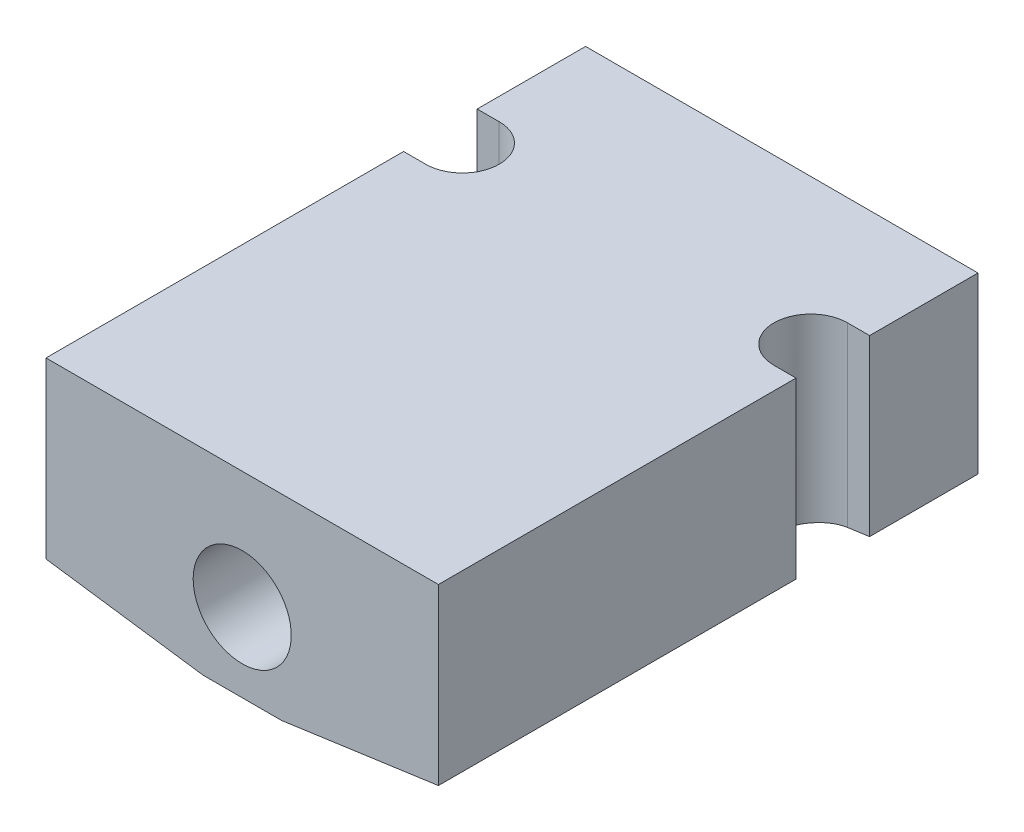
ISO-10303-21;
HEADER;
FILE_DESCRIPTION(('STEP AP214'),'2;1');
FILE_NAME('part.step','',(''),(''),'','','');
FILE_SCHEMA(('AUTOMOTIVE_DESIGN { 1 0 10303 214 1 1 1 1 }'));
ENDSEC;
DATA;
#1=APPLICATION_CONTEXT('core data for automotive mechanical design processes');
#2=APPLICATION_PROTOCOL_DEFINITION('international standard','automotive_design',2000,#1);
#3=PRODUCT_CONTEXT('',#1,'mechanical');
#4=PRODUCT('Part','Part','',(#3));
#5=PRODUCT_RELATED_PRODUCT_CATEGORY('part','',(#4));
#6=PRODUCT_DEFINITION_FORMATION('','',#4);
#7=PRODUCT_DEFINITION_CONTEXT('part definition',#1,'design');
#8=PRODUCT_DEFINITION('design','',#6,#7);
#9=PRODUCT_DEFINITION_SHAPE('','',#8);
#10=(LENGTH_UNIT() NAMED_UNIT(*) SI_UNIT(.MILLI.,.METRE.));
#11=(NAMED_UNIT(*) PLANE_ANGLE_UNIT() SI_UNIT($,.RADIAN.));
#12=(NAMED_UNIT(*) SI_UNIT($,.STERADIAN.) SOLID_ANGLE_UNIT());
#13=UNCERTAINTY_MEASURE_WITH_UNIT(LENGTH_MEASURE(1.E-05),#10,'distance_accuracy_value','');
#14=(GEOMETRIC_REPRESENTATION_CONTEXT(3) GLOBAL_UNCERTAINTY_ASSIGNED_CONTEXT((#13)) GLOBAL_UNIT_ASSIGNED_CONTEXT((#10,
#11,#12)) REPRESENTATION_CONTEXT('',''));
#15=CARTESIAN_POINT('',(0.,0.,0.));
#16=DIRECTION('',(0.,0.,1.));
#17=DIRECTION('',(1.,0.,0.));
#18=AXIS2_PLACEMENT_3D('',#15,#16,#17);
#19=CARTESIAN_POINT('',(12.7,-6.35,34.925));
#20=DIRECTION('',(-1.,0.,0.));
#21=DIRECTION('',(0.,-1.,0.));
#22=AXIS2_PLACEMENT_3D('',#19,#20,#21);
#23=PLANE('',#22);
#24=DIRECTION('',(0.,1.,0.));
#25=VECTOR('',#24,1.);
#26=CARTESIAN_POINT('',(12.7,-6.35,7.01675));
#27=LINE('',#26,#25);
#28=CARTESIAN_POINT('',(12.7,-4.92210511942369,7.01675));
#29=VERTEX_POINT('',#28);
#30=CARTESIAN_POINT('',(12.7,6.35,7.01675));
#31=VERTEX_POINT('',#30);
#32=EDGE_CURVE('E163',#29,#31,#27,.T.);
#33=ORIENTED_EDGE('',*,*,#32,.F.);
#34=DIRECTION('',(0.,0.,-1.));
#35=VECTOR('',#34,1.);
#36=CARTESIAN_POINT('',(12.7,-4.92210511942369,34.925));
#37=LINE('',#36,#35);
#38=CARTESIAN_POINT('',(12.7,-4.92210511942369,0.));
#39=VERTEX_POINT('',#38);
#40=EDGE_CURVE('E214',#29,#39,#37,.T.);
#41=ORIENTED_EDGE('',*,*,#40,.T.);
#42=DIRECTION('',(0.,1.,0.));
#43=VECTOR('',#42,1.);
#44=CARTESIAN_POINT('',(12.7,-6.35,0.));
#45=LINE('',#44,#43);
#46=CARTESIAN_POINT('',(12.7,6.35,0.));
#47=VERTEX_POINT('',#46);
#48=EDGE_CURVE('E204',#39,#47,#45,.T.);
#49=ORIENTED_EDGE('',*,*,#48,.T.);
#50=DIRECTION('',(0.,0.,-1.));
#51=VECTOR('',#50,1.);
#52=CARTESIAN_POINT('',(12.7,6.35,34.925));
#53=LINE('',#52,#51);
#54=EDGE_CURVE('E212',#31,#47,#53,.T.);
#55=ORIENTED_EDGE('',*,*,#54,.F.);
#56=EDGE_LOOP('',(#33,#41,#49,#55));
#57=FACE_BOUND('',#56,.T.);
#58=ADVANCED_FACE('F35',(#57),#23,.F.);
#59=DIRECTION('',(0.,1.,0.));
#60=VECTOR('',#59,1.);
#61=CARTESIAN_POINT('',(12.7,-6.35,11.77925));
#62=LINE('',#61,#60);
#63=CARTESIAN_POINT('',(12.7,-4.92210511942369,11.77925));
#64=VERTEX_POINT('',#63);
#65=CARTESIAN_POINT('',(12.7,6.35,11.77925));
#66=VERTEX_POINT('',#65);
#67=EDGE_CURVE('E50',#64,#66,#62,.T.);
#68=ORIENTED_EDGE('',*,*,#67,.T.);
#69=CARTESIAN_POINT('',(12.7,6.35,34.925));
#70=VERTEX_POINT('',#69);
#71=EDGE_CURVE('E157',#70,#66,#53,.T.);
#72=ORIENTED_EDGE('',*,*,#71,.F.);
#73=DIRECTION('',(0.,1.,0.));
#74=VECTOR('',#73,1.);
#75=CARTESIAN_POINT('',(12.7,-6.35,34.925));
#76=LINE('',#75,#74);
#77=CARTESIAN_POINT('',(12.7,-4.92210511942369,34.925));
#78=VERTEX_POINT('',#77);
#79=EDGE_CURVE('E194',#78,#70,#76,.T.);
#80=ORIENTED_EDGE('',*,*,#79,.F.);
#81=EDGE_CURVE('E215',#78,#64,#37,.T.);
#82=ORIENTED_EDGE('',*,*,#81,.T.);
#83=EDGE_LOOP('',(#68,#72,#80,#82));
#84=FACE_BOUND('',#83,.T.);
#85=ADVANCED_FACE('F290',(#84),#23,.F.);
#86=CARTESIAN_POINT('',(-12.7,6.35,34.925));
#87=DIRECTION('',(0.,-1.,0.));
#88=DIRECTION('',(0.,0.,-1.));
#89=AXIS2_PLACEMENT_3D('',#86,#87,#88);
#90=PLANE('',#89);
#91=DIRECTION('',(1.,0.,0.));
#92=VECTOR('',#91,1.);
#93=CARTESIAN_POINT('',(12.7,6.35,7.01675));
#94=LINE('',#93,#92);
#95=CARTESIAN_POINT('',(11.27125,6.35,7.01675));
#96=VERTEX_POINT('',#95);
#97=EDGE_CURVE('E142',#96,#31,#94,.T.);
#98=ORIENTED_EDGE('',*,*,#97,.T.);
#99=ORIENTED_EDGE('',*,*,#54,.T.);
#100=DIRECTION('',(-1.,0.,0.));
#101=VECTOR('',#100,1.);
#102=CARTESIAN_POINT('',(-12.7,6.35,0.));
#103=LINE('',#102,#101);
#104=CARTESIAN_POINT('',(-12.7,6.35,0.));
#105=VERTEX_POINT('',#104);
#106=EDGE_CURVE('E191',#47,#105,#103,.T.);
#107=ORIENTED_EDGE('',*,*,#106,.T.);
#108=DIRECTION('',(0.,0.,-1.));
#109=VECTOR('',#108,1.);
#110=CARTESIAN_POINT('',(-12.7,6.35,34.925));
#111=LINE('',#110,#109);
#112=CARTESIAN_POINT('',(-12.7,6.35,7.01675));
#113=VERTEX_POINT('',#112);
#114=EDGE_CURVE('E198',#113,#105,#111,.T.);
#115=ORIENTED_EDGE('',*,*,#114,.F.);
#116=DIRECTION('',(-1.,0.,0.));
#117=VECTOR('',#116,1.);
#118=CARTESIAN_POINT('',(-12.7,6.35,7.01675));
#119=LINE('',#118,#117);
#120=CARTESIAN_POINT('',(-11.27125,6.35,7.01675));
#121=VERTEX_POINT('',#120);
#122=EDGE_CURVE('E168',#121,#113,#119,.T.);
#123=ORIENTED_EDGE('',*,*,#122,.F.);
#124=CARTESIAN_POINT('',(-11.27125,6.35,9.398));
#125=DIRECTION('',(0.,1.,0.));
#126=DIRECTION('',(0.,0.,1.));
#127=AXIS2_PLACEMENT_3D('',#124,#125,#126);
#128=CIRCLE('',#127,2.38125);
#129=CARTESIAN_POINT('',(-11.27125,6.35,11.77925));
#130=VERTEX_POINT('',#129);
#131=EDGE_CURVE('E162',#130,#121,#128,.T.);
#132=ORIENTED_EDGE('',*,*,#131,.F.);
#133=DIRECTION('',(1.,0.,0.));
#134=VECTOR('',#133,1.);
#135=CARTESIAN_POINT('',(-11.27125,6.35,11.77925));
#136=LINE('',#135,#134);
#137=CARTESIAN_POINT('',(-12.7,6.35,11.77925));
#138=VERTEX_POINT('',#137);
#139=EDGE_CURVE('E170',#138,#130,#136,.T.);
#140=ORIENTED_EDGE('',*,*,#139,.F.);
#141=CARTESIAN_POINT('',(-12.7,6.35,34.925));
#142=VERTEX_POINT('',#141);
#143=EDGE_CURVE('E209',#142,#138,#111,.T.);
#144=ORIENTED_EDGE('',*,*,#143,.F.);
#145=DIRECTION('',(-1.,0.,0.));
#146=VECTOR('',#145,1.);
#147=CARTESIAN_POINT('',(-12.7,6.35,34.925));
#148=LINE('',#147,#146);
#149=EDGE_CURVE('E196',#70,#142,#148,.T.);
#150=ORIENTED_EDGE('',*,*,#149,.F.);
#151=ORIENTED_EDGE('',*,*,#71,.T.);
#152=DIRECTION('',(-1.,0.,0.));
#153=VECTOR('',#152,1.);
#154=CARTESIAN_POINT('',(11.27125,6.35,11.77925));
#155=LINE('',#154,#153);
#156=CARTESIAN_POINT('',(11.27125,6.35,11.77925));
#157=VERTEX_POINT('',#156);
#158=EDGE_CURVE('E138',#66,#157,#155,.T.);
#159=ORIENTED_EDGE('',*,*,#158,.T.);
#160=CARTESIAN_POINT('',(11.27125,6.35,9.398));
#161=DIRECTION('',(0.,-1.,0.));
#162=DIRECTION('',(0.,0.,1.));
#163=AXIS2_PLACEMENT_3D('',#160,#161,#162);
#164=CIRCLE('',#163,2.38125);
#165=EDGE_CURVE('E145',#157,#96,#164,.T.);
#166=ORIENTED_EDGE('',*,*,#165,.T.);
#167=EDGE_LOOP('',(#98,#99,#107,#115,#123,#132,#140,#144,#150,#151,#159,#166));
#168=FACE_BOUND('',#167,.T.);
#169=ADVANCED_FACE('F154',(#168),#90,.F.);
#170=CARTESIAN_POINT('',(12.7,-4.92210511942369,34.925));
#171=DIRECTION('',(-0.139173100960063,0.990268068741571,0.));
#172=DIRECTION('',(-0.990268068741571,-0.139173100960063,0.));
#173=AXIS2_PLACEMENT_3D('',#170,#171,#172);
#174=PLANE('',#173);
#175=ORIENTED_EDGE('',*,*,#40,.F.);
#176=DIRECTION('',(0.990268068741571,0.139173100960063,0.));
#177=VECTOR('',#176,1.);
#178=CARTESIAN_POINT('',(12.7,-4.92210511942369,7.01675));
#179=LINE('',#178,#177);
#180=CARTESIAN_POINT('',(11.27125,-5.12290283700473,7.01675));
#181=VERTEX_POINT('',#180);
#182=EDGE_CURVE('E11',#29,#181,#179,.F.);
#183=ORIENTED_EDGE('',*,*,#182,.T.);
#184=CARTESIAN_POINT('',(11.27125,-5.12290283700473,9.398));
#185=DIRECTION('',(-0.139173100960063,0.990268068741571,0.));
#186=DIRECTION('',(0.990268068741571,0.139173100960063,0.));
#187=AXIS2_PLACEMENT_3D('',#184,#185,#186);
#188=ELLIPSE('',#187,2.40465190705996,2.38125);
#189=CARTESIAN_POINT('',(11.27125,-5.12290283700473,11.77925));
#190=VERTEX_POINT('',#189);
#191=EDGE_CURVE('E43',#181,#190,#188,.T.);
#192=ORIENTED_EDGE('',*,*,#191,.T.);
#193=DIRECTION('',(-0.990268068741571,-0.139173100960063,0.));
#194=VECTOR('',#193,1.);
#195=CARTESIAN_POINT('',(12.7,-4.92210511942369,11.77925));
#196=LINE('',#195,#194);
#197=EDGE_CURVE('E139',#190,#64,#196,.F.);
#198=ORIENTED_EDGE('',*,*,#197,.T.);
#199=ORIENTED_EDGE('',*,*,#81,.F.);
#200=DIRECTION('',(-0.990268068741571,-0.139173100960063,0.));
#201=VECTOR('',#200,1.);
#202=CARTESIAN_POINT('',(12.7,-4.92210511942369,34.925));
#203=LINE('',#202,#201);
#204=CARTESIAN_POINT('',(2.5399999999998,-6.34999999999999,34.925));
#205=VERTEX_POINT('',#204);
#206=EDGE_CURVE('E229',#205,#78,#203,.F.);
#207=ORIENTED_EDGE('',*,*,#206,.F.);
#208=DIRECTION('',(0.,0.,1.));
#209=VECTOR('',#208,1.);
#210=CARTESIAN_POINT('',(2.53999999999974,-6.35,34.925));
#211=LINE('',#210,#209);
#212=CARTESIAN_POINT('',(2.53999999999974,-6.35,0.));
#213=VERTEX_POINT('',#212);
#214=EDGE_CURVE('E225',#213,#205,#211,.T.);
#215=ORIENTED_EDGE('',*,*,#214,.F.);
#216=DIRECTION('',(0.990268068741571,0.139173100960063,0.));
#217=VECTOR('',#216,1.);
#218=CARTESIAN_POINT('',(-10.6545169136121,-8.20436842053379,0.));
#219=LINE('',#218,#217);
#220=EDGE_CURVE('E220',#39,#213,#219,.F.);
#221=ORIENTED_EDGE('',*,*,#220,.F.);
#222=EDGE_LOOP('',(#175,#183,#192,#198,#199,#207,#215,#221));
#223=FACE_BOUND('',#222,.T.);
#224=ADVANCED_FACE('F243',(#223),#174,.F.);
#225=CARTESIAN_POINT('',(-12.7,-6.35,34.925));
#226=DIRECTION('',(1.,0.,0.));
#227=DIRECTION('',(0.,1.,0.));
#228=AXIS2_PLACEMENT_3D('',#225,#226,#227);
#229=PLANE('',#228);
#230=ORIENTED_EDGE('',*,*,#143,.T.);
#231=DIRECTION('',(0.,1.,0.));
#232=VECTOR('',#231,1.);
#233=CARTESIAN_POINT('',(-12.7,-6.35,11.77925));
#234=LINE('',#233,#232);
#235=CARTESIAN_POINT('',(-12.7,-4.92210511942369,11.77925));
#236=VERTEX_POINT('',#235);
#237=EDGE_CURVE('E177',#236,#138,#234,.T.);
#238=ORIENTED_EDGE('',*,*,#237,.F.);
#239=DIRECTION('',(0.,0.,1.));
#240=VECTOR('',#239,1.);
#241=CARTESIAN_POINT('',(-12.7,-4.92210511942369,34.925));
#242=LINE('',#241,#240);
#243=CARTESIAN_POINT('',(-12.7,-4.92210511942369,34.925));
#244=VERTEX_POINT('',#243);
#245=EDGE_CURVE('E231',#236,#244,#242,.T.);
#246=ORIENTED_EDGE('',*,*,#245,.T.);
#247=DIRECTION('',(0.,-1.,0.));
#248=VECTOR('',#247,1.);
#249=CARTESIAN_POINT('',(-12.7,-6.35,34.925));
#250=LINE('',#249,#248);
#251=EDGE_CURVE('E187',#142,#244,#250,.T.);
#252=ORIENTED_EDGE('',*,*,#251,.F.);
#253=EDGE_LOOP('',(#230,#238,#246,#252));
#254=FACE_BOUND('',#253,.T.);
#255=ADVANCED_FACE('F277',(#254),#229,.F.);
#256=CARTESIAN_POINT('',(-12.7,-4.92210511942369,0.));
#257=VERTEX_POINT('',#256);
#258=CARTESIAN_POINT('',(-12.7,-4.92210511942369,7.01675));
#259=VERTEX_POINT('',#258);
#260=EDGE_CURVE('E232',#257,#259,#242,.T.);
#261=ORIENTED_EDGE('',*,*,#260,.T.);
#262=DIRECTION('',(0.,1.,0.));
#263=VECTOR('',#262,1.);
#264=CARTESIAN_POINT('',(-12.7,-6.35,7.01675));
#265=LINE('',#264,#263);
#266=EDGE_CURVE('E58',#259,#113,#265,.T.);
#267=ORIENTED_EDGE('',*,*,#266,.T.);
#268=ORIENTED_EDGE('',*,*,#114,.T.);
#269=DIRECTION('',(0.,-1.,0.));
#270=VECTOR('',#269,1.);
#271=CARTESIAN_POINT('',(-12.7,-6.35,0.));
#272=LINE('',#271,#270);
#273=EDGE_CURVE('E186',#105,#257,#272,.T.);
#274=ORIENTED_EDGE('',*,*,#273,.T.);
#275=EDGE_LOOP('',(#261,#267,#268,#274));
#276=FACE_BOUND('',#275,.T.);
#277=ADVANCED_FACE('F260',(#276),#229,.F.);
#278=CARTESIAN_POINT('',(-12.7,-6.35,34.925));
#279=DIRECTION('',(0.,1.,0.));
#280=DIRECTION('',(0.,0.,1.));
#281=AXIS2_PLACEMENT_3D('',#278,#279,#280);
#282=PLANE('',#281);
#283=DIRECTION('',(1.,0.,0.));
#284=VECTOR('',#283,1.);
#285=CARTESIAN_POINT('',(-12.7,-6.35,0.));
#286=LINE('',#285,#284);
#287=CARTESIAN_POINT('',(-2.53999999999973,-6.35,0.));
#288=VERTEX_POINT('',#287);
#289=EDGE_CURVE('E201',#288,#213,#286,.T.);
#290=ORIENTED_EDGE('',*,*,#289,.T.);
#291=ORIENTED_EDGE('',*,*,#214,.T.);
#292=DIRECTION('',(1.,0.,0.));
#293=VECTOR('',#292,1.);
#294=CARTESIAN_POINT('',(-12.7,-6.35,34.925));
#295=LINE('',#294,#293);
#296=CARTESIAN_POINT('',(-2.53999999999984,-6.34999999999999,34.925));
#297=VERTEX_POINT('',#296);
#298=EDGE_CURVE('E190',#297,#205,#295,.T.);
#299=ORIENTED_EDGE('',*,*,#298,.F.);
#300=DIRECTION('',(0.,0.,-1.));
#301=VECTOR('',#300,1.);
#302=CARTESIAN_POINT('',(-2.53999999999975,-6.35,34.925));
#303=LINE('',#302,#301);
#304=EDGE_CURVE('E222',#297,#288,#303,.T.);
#305=ORIENTED_EDGE('',*,*,#304,.T.);
#306=EDGE_LOOP('',(#290,#291,#299,#305));
#307=FACE_BOUND('',#306,.T.);
#308=ADVANCED_FACE('F285',(#307),#282,.F.);
#309=CARTESIAN_POINT('',(-12.7,6.35,34.925));
#310=DIRECTION('',(0.,0.,-1.));
#311=DIRECTION('',(-1.,0.,0.));
#312=AXIS2_PLACEMENT_3D('',#309,#310,#311);
#313=PLANE('',#312);
#314=CARTESIAN_POINT('',(0.,-1.26999999999999,34.925));
#315=DIRECTION('',(0.,0.,-1.));
#316=DIRECTION('',(-1.,0.,0.));
#317=AXIS2_PLACEMENT_3D('',#314,#315,#316);
#318=CIRCLE('',#317,3.17499999999999);
#319=CARTESIAN_POINT('',(-3.17499999999999,-1.26999999999999,34.925));
#320=VERTEX_POINT('',#319);
#321=EDGE_CURVE('E183',#320,#320,#318,.T.);
#322=ORIENTED_EDGE('',*,*,#321,.T.);
#323=EDGE_LOOP('',(#322));
#324=FACE_BOUND('',#323,.T.);
#325=ORIENTED_EDGE('',*,*,#298,.T.);
#326=ORIENTED_EDGE('',*,*,#206,.T.);
#327=ORIENTED_EDGE('',*,*,#79,.T.);
#328=ORIENTED_EDGE('',*,*,#149,.T.);
#329=ORIENTED_EDGE('',*,*,#251,.T.);
#330=DIRECTION('',(-0.990268068741571,0.139173100960063,0.));
#331=VECTOR('',#330,1.);
#332=CARTESIAN_POINT('',(-2.53999999999975,-6.35,34.925));
#333=LINE('',#332,#331);
#334=EDGE_CURVE('E227',#244,#297,#333,.F.);
#335=ORIENTED_EDGE('',*,*,#334,.T.);
#336=EDGE_LOOP('',(#325,#326,#327,#328,#329,#335));
#337=FACE_BOUND('',#336,.T.);
#338=ADVANCED_FACE('F281',(#324,#337),#313,.F.);
#339=CARTESIAN_POINT('',(-12.7,6.35,0.));
#340=DIRECTION('',(0.,0.,-1.));
#341=DIRECTION('',(-1.,0.,0.));
#342=AXIS2_PLACEMENT_3D('',#339,#340,#341);
#343=PLANE('',#342);
#344=CARTESIAN_POINT('',(0.,-1.26999999999999,0.));
#345=DIRECTION('',(0.,0.,-1.));
#346=DIRECTION('',(-1.,0.,0.));
#347=AXIS2_PLACEMENT_3D('',#344,#345,#346);
#348=CIRCLE('',#347,3.17499999999999);
#349=CARTESIAN_POINT('',(-3.17499999999999,-1.26999999999999,0.));
#350=VERTEX_POINT('',#349);
#351=EDGE_CURVE('E176',#350,#350,#348,.T.);
#352=ORIENTED_EDGE('',*,*,#351,.F.);
#353=EDGE_LOOP('',(#352));
#354=FACE_BOUND('',#353,.T.);
#355=ORIENTED_EDGE('',*,*,#48,.F.);
#356=ORIENTED_EDGE('',*,*,#220,.T.);
#357=ORIENTED_EDGE('',*,*,#289,.F.);
#358=DIRECTION('',(0.990268068741571,-0.139173100960063,0.));
#359=VECTOR('',#358,1.);
#360=CARTESIAN_POINT('',(-14.2535066248046,-4.70377400165797,0.));
#361=LINE('',#360,#359);
#362=EDGE_CURVE('E218',#288,#257,#361,.F.);
#363=ORIENTED_EDGE('',*,*,#362,.T.);
#364=ORIENTED_EDGE('',*,*,#273,.F.);
#365=ORIENTED_EDGE('',*,*,#106,.F.);
#366=EDGE_LOOP('',(#355,#356,#357,#363,#364,#365));
#367=FACE_BOUND('',#366,.T.);
#368=ADVANCED_FACE('F255',(#354,#367),#343,.T.);
#369=CARTESIAN_POINT('',(-2.53999999999975,-6.35,34.925));
#370=DIRECTION('',(0.139173100960063,0.990268068741571,0.));
#371=DIRECTION('',(-0.990268068741571,0.139173100960063,0.));
#372=AXIS2_PLACEMENT_3D('',#369,#370,#371);
#373=PLANE('',#372);
#374=DIRECTION('',(0.990268068741571,-0.139173100960063,0.));
#375=VECTOR('',#374,1.);
#376=CARTESIAN_POINT('',(-2.53999999999972,-6.35,11.77925));
#377=LINE('',#376,#375);
#378=CARTESIAN_POINT('',(-11.27125,-5.12290283700473,11.77925));
#379=VERTEX_POINT('',#378);
#380=EDGE_CURVE('E239',#379,#236,#377,.F.);
#381=ORIENTED_EDGE('',*,*,#380,.F.);
#382=CARTESIAN_POINT('',(-11.27125,-5.12290283700473,9.398));
#383=DIRECTION('',(0.139173100960063,0.990268068741571,0.));
#384=DIRECTION('',(-0.990268068741571,0.139173100960063,0.));
#385=AXIS2_PLACEMENT_3D('',#382,#383,#384);
#386=ELLIPSE('',#385,2.40465190705996,2.38125);
#387=CARTESIAN_POINT('',(-11.27125,-5.12290283700473,7.01675));
#388=VERTEX_POINT('',#387);
#389=EDGE_CURVE('E237',#388,#379,#386,.F.);
#390=ORIENTED_EDGE('',*,*,#389,.F.);
#391=DIRECTION('',(-0.990268068741571,0.139173100960063,0.));
#392=VECTOR('',#391,1.);
#393=CARTESIAN_POINT('',(-2.53999999999976,-6.34999999999999,7.01675));
#394=LINE('',#393,#392);
#395=EDGE_CURVE('E235',#259,#388,#394,.F.);
#396=ORIENTED_EDGE('',*,*,#395,.F.);
#397=ORIENTED_EDGE('',*,*,#260,.F.);
#398=ORIENTED_EDGE('',*,*,#362,.F.);
#399=ORIENTED_EDGE('',*,*,#304,.F.);
#400=ORIENTED_EDGE('',*,*,#334,.F.);
#401=ORIENTED_EDGE('',*,*,#245,.F.);
#402=EDGE_LOOP('',(#381,#390,#396,#397,#398,#399,#400,#401));
#403=FACE_BOUND('',#402,.T.);
#404=ADVANCED_FACE('F37',(#403),#373,.F.);
#405=CARTESIAN_POINT('',(0.,-1.26999999999999,0.));
#406=DIRECTION('',(0.,0.,-1.));
#407=DIRECTION('',(-1.,0.,0.));
#408=AXIS2_PLACEMENT_3D('',#405,#406,#407);
#409=CYLINDRICAL_SURFACE('',#408,3.17499999999999);
#410=ORIENTED_EDGE('',*,*,#321,.F.);
#411=EDGE_LOOP('',(#410));
#412=FACE_BOUND('',#411,.T.);
#413=ORIENTED_EDGE('',*,*,#351,.T.);
#414=EDGE_LOOP('',(#413));
#415=FACE_BOUND('',#414,.T.);
#416=ADVANCED_FACE('F337',(#412,#415),#409,.F.);
#417=CARTESIAN_POINT('',(-11.27125,-6.35,9.398));
#418=DIRECTION('',(0.,1.,0.));
#419=DIRECTION('',(0.,0.,1.));
#420=AXIS2_PLACEMENT_3D('',#417,#418,#419);
#421=CYLINDRICAL_SURFACE('',#420,2.38125);
#422=ORIENTED_EDGE('',*,*,#389,.T.);
#423=DIRECTION('',(0.,1.,0.));
#424=VECTOR('',#423,1.);
#425=CARTESIAN_POINT('',(-11.27125,-6.35,11.77925));
#426=LINE('',#425,#424);
#427=EDGE_CURVE('E174',#379,#130,#426,.T.);
#428=ORIENTED_EDGE('',*,*,#427,.T.);
#429=ORIENTED_EDGE('',*,*,#131,.T.);
#430=DIRECTION('',(0.,1.,0.));
#431=VECTOR('',#430,1.);
#432=CARTESIAN_POINT('',(-11.27125,-6.35,7.01675));
#433=LINE('',#432,#431);
#434=EDGE_CURVE('E173',#388,#121,#433,.T.);
#435=ORIENTED_EDGE('',*,*,#434,.F.);
#436=EDGE_LOOP('',(#422,#428,#429,#435));
#437=FACE_BOUND('',#436,.T.);
#438=ADVANCED_FACE('F269',(#437),#421,.F.);
#439=CARTESIAN_POINT('',(-11.27125,-6.35,11.77925));
#440=DIRECTION('',(0.,0.,1.));
#441=DIRECTION('',(1.,0.,0.));
#442=AXIS2_PLACEMENT_3D('',#439,#440,#441);
#443=PLANE('',#442);
#444=ORIENTED_EDGE('',*,*,#380,.T.);
#445=ORIENTED_EDGE('',*,*,#237,.T.);
#446=ORIENTED_EDGE('',*,*,#139,.T.);
#447=ORIENTED_EDGE('',*,*,#427,.F.);
#448=EDGE_LOOP('',(#444,#445,#446,#447));
#449=FACE_BOUND('',#448,.T.);
#450=ADVANCED_FACE('F349',(#449),#443,.F.);
#451=CARTESIAN_POINT('',(-12.7,-6.35,7.01675));
#452=DIRECTION('',(0.,0.,-1.));
#453=DIRECTION('',(-1.,0.,0.));
#454=AXIS2_PLACEMENT_3D('',#451,#452,#453);
#455=PLANE('',#454);
#456=ORIENTED_EDGE('',*,*,#395,.T.);
#457=ORIENTED_EDGE('',*,*,#434,.T.);
#458=ORIENTED_EDGE('',*,*,#122,.T.);
#459=ORIENTED_EDGE('',*,*,#266,.F.);
#460=EDGE_LOOP('',(#456,#457,#458,#459));
#461=FACE_BOUND('',#460,.T.);
#462=ADVANCED_FACE('F267',(#461),#455,.F.);
#463=CARTESIAN_POINT('',(11.27125,-6.35,9.398));
#464=DIRECTION('',(0.,1.,0.));
#465=DIRECTION('',(0.,0.,1.));
#466=AXIS2_PLACEMENT_3D('',#463,#464,#465);
#467=CYLINDRICAL_SURFACE('',#466,2.38125);
#468=DIRECTION('',(0.,1.,0.));
#469=VECTOR('',#468,1.);
#470=CARTESIAN_POINT('',(11.27125,-6.35,7.01675));
#471=LINE('',#470,#469);
#472=EDGE_CURVE('E148',#181,#96,#471,.T.);
#473=ORIENTED_EDGE('',*,*,#472,.T.);
#474=ORIENTED_EDGE('',*,*,#165,.F.);
#475=DIRECTION('',(0.,1.,0.));
#476=VECTOR('',#475,1.);
#477=CARTESIAN_POINT('',(11.27125,-6.35,11.77925));
#478=LINE('',#477,#476);
#479=EDGE_CURVE('E134',#190,#157,#478,.T.);
#480=ORIENTED_EDGE('',*,*,#479,.F.);
#481=ORIENTED_EDGE('',*,*,#191,.F.);
#482=EDGE_LOOP('',(#473,#474,#480,#481));
#483=FACE_BOUND('',#482,.T.);
#484=ADVANCED_FACE('F146',(#483),#467,.F.);
#485=CARTESIAN_POINT('',(12.7,-6.35,7.01675));
#486=DIRECTION('',(0.,0.,1.));
#487=DIRECTION('',(1.,0.,0.));
#488=AXIS2_PLACEMENT_3D('',#485,#486,#487);
#489=PLANE('',#488);
#490=ORIENTED_EDGE('',*,*,#32,.T.);
#491=ORIENTED_EDGE('',*,*,#97,.F.);
#492=ORIENTED_EDGE('',*,*,#472,.F.);
#493=ORIENTED_EDGE('',*,*,#182,.F.);
#494=EDGE_LOOP('',(#490,#491,#492,#493));
#495=FACE_BOUND('',#494,.T.);
#496=ADVANCED_FACE('F246',(#495),#489,.T.);
#497=CARTESIAN_POINT('',(11.27125,-6.35,11.77925));
#498=DIRECTION('',(0.,0.,-1.));
#499=DIRECTION('',(-1.,0.,0.));
#500=AXIS2_PLACEMENT_3D('',#497,#498,#499);
#501=PLANE('',#500);
#502=ORIENTED_EDGE('',*,*,#479,.T.);
#503=ORIENTED_EDGE('',*,*,#158,.F.);
#504=ORIENTED_EDGE('',*,*,#67,.F.);
#505=ORIENTED_EDGE('',*,*,#197,.F.);
#506=EDGE_LOOP('',(#502,#503,#504,#505));
#507=FACE_BOUND('',#506,.T.);
#508=ADVANCED_FACE('F136',(#507),#501,.T.);
#509=CLOSED_SHELL('',(#58,#85,#169,#224,#255,#277,#308,#338,#368,#404,#416,#438,#450,#462,#484,
#496,#508));
#510=MANIFOLD_SOLID_BREP('B2',#509);
#511=ADVANCED_BREP_SHAPE_REPRESENTATION('',(#18,#510),#14);
#512=SHAPE_DEFINITION_REPRESENTATION(#9,#511);
ENDSEC;
END-ISO-10303-21;
